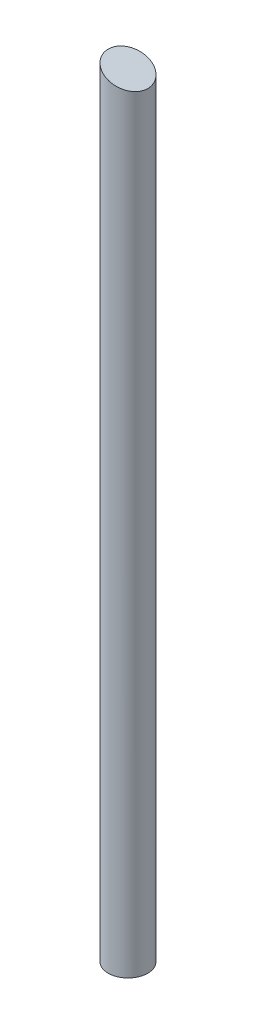
ISO-10303-21;
HEADER;
FILE_DESCRIPTION(('STEP AP214'),'2;1');
FILE_NAME('part.step','',(''),(''),'','','');
FILE_SCHEMA(('AUTOMOTIVE_DESIGN { 1 0 10303 214 1 1 1 1 }'));
ENDSEC;
DATA;
#1=APPLICATION_CONTEXT('core data for automotive mechanical design processes');
#2=APPLICATION_PROTOCOL_DEFINITION('international standard','automotive_design',2000,#1);
#3=PRODUCT_CONTEXT('',#1,'mechanical');
#4=PRODUCT('Part','Part','',(#3));
#5=PRODUCT_RELATED_PRODUCT_CATEGORY('part','',(#4));
#6=PRODUCT_DEFINITION_FORMATION('','',#4);
#7=PRODUCT_DEFINITION_CONTEXT('part definition',#1,'design');
#8=PRODUCT_DEFINITION('design','',#6,#7);
#9=PRODUCT_DEFINITION_SHAPE('','',#8);
#10=(LENGTH_UNIT() NAMED_UNIT(*) SI_UNIT(.MILLI.,.METRE.));
#11=(NAMED_UNIT(*) PLANE_ANGLE_UNIT() SI_UNIT($,.RADIAN.));
#12=(NAMED_UNIT(*) SI_UNIT($,.STERADIAN.) SOLID_ANGLE_UNIT());
#13=UNCERTAINTY_MEASURE_WITH_UNIT(LENGTH_MEASURE(1.E-05),#10,'distance_accuracy_value','');
#14=(GEOMETRIC_REPRESENTATION_CONTEXT(3) GLOBAL_UNCERTAINTY_ASSIGNED_CONTEXT((#13)) GLOBAL_UNIT_ASSIGNED_CONTEXT((#10,
#11,#12)) REPRESENTATION_CONTEXT('',''));
#15=CARTESIAN_POINT('',(0.,0.,0.));
#16=DIRECTION('',(0.,0.,1.));
#17=DIRECTION('',(1.,0.,0.));
#18=AXIS2_PLACEMENT_3D('',#15,#16,#17);
#19=CARTESIAN_POINT('',(0.,138.,0.));
#20=DIRECTION('',(0.,-1.,0.));
#21=DIRECTION('',(0.,0.,-1.));
#22=AXIS2_PLACEMENT_3D('',#19,#20,#21);
#23=CYLINDRICAL_SURFACE('',#22,3.5);
#24=CARTESIAN_POINT('',(0.,136.726104180068,0.));
#25=DIRECTION('',(-0.342020143325671,-0.939692620785908,0.));
#26=DIRECTION('',(0.939692620785908,-0.342020143325671,0.));
#27=AXIS2_PLACEMENT_3D('',#24,#25,#26);
#28=ELLIPSE('',#27,3.7246222036657,3.5);
#29=CARTESIAN_POINT('',(3.5,135.452208360137,0.));
#30=VERTEX_POINT('',#29);
#31=EDGE_CURVE('E38',#30,#30,#28,.T.);
#32=ORIENTED_EDGE('',*,*,#31,.T.);
#33=EDGE_LOOP('',(#32));
#34=FACE_BOUND('',#33,.T.);
#35=CARTESIAN_POINT('',(0.,0.,0.));
#36=DIRECTION('',(0.,1.,0.));
#37=DIRECTION('',(0.,0.,1.));
#38=AXIS2_PLACEMENT_3D('',#35,#36,#37);
#39=CIRCLE('',#38,3.5);
#40=CARTESIAN_POINT('',(0.,0.,3.5));
#41=VERTEX_POINT('',#40);
#42=EDGE_CURVE('E10',#41,#41,#39,.T.);
#43=ORIENTED_EDGE('',*,*,#42,.T.);
#44=EDGE_LOOP('',(#43));
#45=FACE_BOUND('',#44,.T.);
#46=ADVANCED_FACE('F32',(#34,#45),#23,.T.);
#47=CARTESIAN_POINT('',(0.,0.,0.));
#48=DIRECTION('',(0.,1.,0.));
#49=DIRECTION('',(0.,0.,1.));
#50=AXIS2_PLACEMENT_3D('',#47,#48,#49);
#51=PLANE('',#50);
#52=ORIENTED_EDGE('',*,*,#42,.F.);
#53=EDGE_LOOP('',(#52));
#54=FACE_BOUND('',#53,.T.);
#55=ADVANCED_FACE('F47',(#54),#51,.F.);
#56=CARTESIAN_POINT('',(-3.5,138.,-5.));
#57=DIRECTION('',(-0.342020143325671,-0.939692620785908,0.));
#58=DIRECTION('',(0.939692620785908,-0.342020143325671,0.));
#59=AXIS2_PLACEMENT_3D('',#56,#57,#58);
#60=PLANE('',#59);
#61=ORIENTED_EDGE('',*,*,#31,.F.);
#62=EDGE_LOOP('',(#61));
#63=FACE_BOUND('',#62,.T.);
#64=ADVANCED_FACE('F45',(#63),#60,.F.);
#65=CLOSED_SHELL('',(#46,#55,#64));
#66=MANIFOLD_SOLID_BREP('B2',#65);
#67=ADVANCED_BREP_SHAPE_REPRESENTATION('',(#18,#66),#14);
#68=SHAPE_DEFINITION_REPRESENTATION(#9,#67);
ENDSEC;
END-ISO-10303-21;
